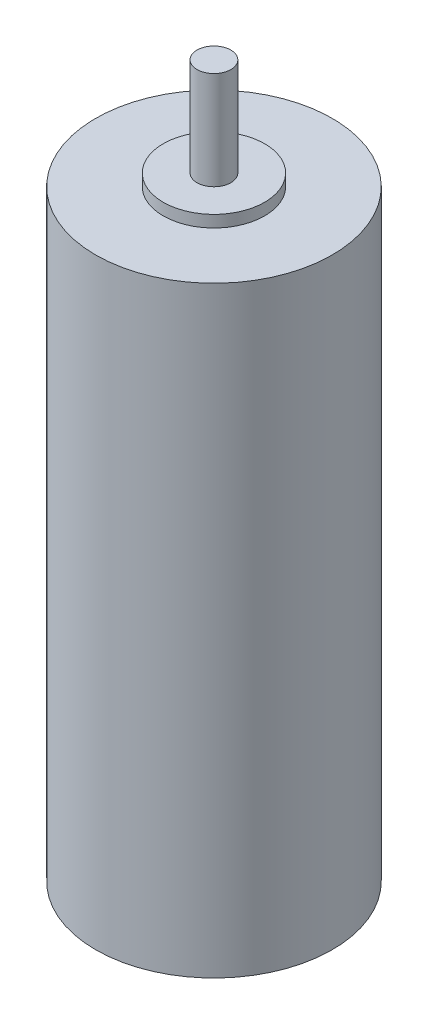
ISO-10303-21;
HEADER;
FILE_DESCRIPTION(('STEP AP214'),'2;1');
FILE_NAME('part.step','',(''),(''),'','','');
FILE_SCHEMA(('AUTOMOTIVE_DESIGN { 1 0 10303 214 1 1 1 1 }'));
ENDSEC;
DATA;
#1=APPLICATION_CONTEXT('core data for automotive mechanical design processes');
#2=APPLICATION_PROTOCOL_DEFINITION('international standard','automotive_design',2000,#1);
#3=PRODUCT_CONTEXT('',#1,'mechanical');
#4=PRODUCT('Part','Part','',(#3));
#5=PRODUCT_RELATED_PRODUCT_CATEGORY('part','',(#4));
#6=PRODUCT_DEFINITION_FORMATION('','',#4);
#7=PRODUCT_DEFINITION_CONTEXT('part definition',#1,'design');
#8=PRODUCT_DEFINITION('design','',#6,#7);
#9=PRODUCT_DEFINITION_SHAPE('','',#8);
#10=(LENGTH_UNIT() NAMED_UNIT(*) SI_UNIT(.MILLI.,.METRE.));
#11=(NAMED_UNIT(*) PLANE_ANGLE_UNIT() SI_UNIT($,.RADIAN.));
#12=(NAMED_UNIT(*) SI_UNIT($,.STERADIAN.) SOLID_ANGLE_UNIT());
#13=UNCERTAINTY_MEASURE_WITH_UNIT(LENGTH_MEASURE(1.E-05),#10,'distance_accuracy_value','');
#14=(GEOMETRIC_REPRESENTATION_CONTEXT(3) GLOBAL_UNCERTAINTY_ASSIGNED_CONTEXT((#13)) GLOBAL_UNIT_ASSIGNED_CONTEXT((#10,
#11,#12)) REPRESENTATION_CONTEXT('',''));
#15=CARTESIAN_POINT('',(0.,0.,0.));
#16=DIRECTION('',(0.,0.,1.));
#17=DIRECTION('',(1.,0.,0.));
#18=AXIS2_PLACEMENT_3D('',#15,#16,#17);
#19=CARTESIAN_POINT('',(0.,35.6,0.));
#20=DIRECTION('',(0.,-1.,0.));
#21=DIRECTION('',(0.,0.,-1.));
#22=AXIS2_PLACEMENT_3D('',#19,#20,#21);
#23=CYLINDRICAL_SURFACE('',#22,7.);
#24=CARTESIAN_POINT('',(0.,35.6,0.));
#25=DIRECTION('',(0.,1.,0.));
#26=DIRECTION('',(0.,0.,1.));
#27=AXIS2_PLACEMENT_3D('',#24,#25,#26);
#28=CIRCLE('',#27,7.);
#29=CARTESIAN_POINT('',(0.,35.6,7.));
#30=VERTEX_POINT('',#29);
#31=EDGE_CURVE('E41',#30,#30,#28,.T.);
#32=ORIENTED_EDGE('',*,*,#31,.F.);
#33=EDGE_LOOP('',(#32));
#34=FACE_BOUND('',#33,.T.);
#35=CARTESIAN_POINT('',(0.,0.,0.));
#36=DIRECTION('',(0.,1.,0.));
#37=DIRECTION('',(0.,0.,1.));
#38=AXIS2_PLACEMENT_3D('',#35,#36,#37);
#39=CIRCLE('',#38,7.);
#40=CARTESIAN_POINT('',(0.,0.,7.));
#41=VERTEX_POINT('',#40);
#42=EDGE_CURVE('E46',#41,#41,#39,.T.);
#43=ORIENTED_EDGE('',*,*,#42,.T.);
#44=EDGE_LOOP('',(#43));
#45=FACE_BOUND('',#44,.T.);
#46=ADVANCED_FACE('F34',(#34,#45),#23,.T.);
#47=CARTESIAN_POINT('',(0.,35.6,0.));
#48=DIRECTION('',(0.,1.,0.));
#49=DIRECTION('',(0.,0.,1.));
#50=AXIS2_PLACEMENT_3D('',#47,#48,#49);
#51=PLANE('',#50);
#52=CARTESIAN_POINT('',(0.,35.6,0.));
#53=DIRECTION('',(0.,1.,0.));
#54=DIRECTION('',(0.,0.,1.));
#55=AXIS2_PLACEMENT_3D('',#52,#53,#54);
#56=CIRCLE('',#55,3.);
#57=CARTESIAN_POINT('',(0.,35.6,3.));
#58=VERTEX_POINT('',#57);
#59=EDGE_CURVE('E10',#58,#58,#56,.T.);
#60=ORIENTED_EDGE('',*,*,#59,.F.);
#61=EDGE_LOOP('',(#60));
#62=FACE_BOUND('',#61,.T.);
#63=ORIENTED_EDGE('',*,*,#31,.T.);
#64=EDGE_LOOP('',(#63));
#65=FACE_BOUND('',#64,.T.);
#66=ADVANCED_FACE('F79',(#62,#65),#51,.T.);
#67=CARTESIAN_POINT('',(0.,0.,0.));
#68=DIRECTION('',(0.,1.,0.));
#69=DIRECTION('',(0.,0.,1.));
#70=AXIS2_PLACEMENT_3D('',#67,#68,#69);
#71=PLANE('',#70);
#72=ORIENTED_EDGE('',*,*,#42,.F.);
#73=EDGE_LOOP('',(#72));
#74=FACE_BOUND('',#73,.T.);
#75=ADVANCED_FACE('F84',(#74),#71,.F.);
#76=CARTESIAN_POINT('',(0.,36.3,0.));
#77=DIRECTION('',(0.,-1.,0.));
#78=DIRECTION('',(0.,0.,-1.));
#79=AXIS2_PLACEMENT_3D('',#76,#77,#78);
#80=CYLINDRICAL_SURFACE('',#79,3.);
#81=CARTESIAN_POINT('',(0.,36.3,0.));
#82=DIRECTION('',(0.,1.,0.));
#83=DIRECTION('',(0.,0.,1.));
#84=AXIS2_PLACEMENT_3D('',#81,#82,#83);
#85=CIRCLE('',#84,3.);
#86=CARTESIAN_POINT('',(0.,36.3,3.));
#87=VERTEX_POINT('',#86);
#88=EDGE_CURVE('E49',#87,#87,#85,.T.);
#89=ORIENTED_EDGE('',*,*,#88,.F.);
#90=EDGE_LOOP('',(#89));
#91=FACE_BOUND('',#90,.T.);
#92=ORIENTED_EDGE('',*,*,#59,.T.);
#93=EDGE_LOOP('',(#92));
#94=FACE_BOUND('',#93,.T.);
#95=ADVANCED_FACE('F76',(#91,#94),#80,.T.);
#96=CARTESIAN_POINT('',(0.,36.3,0.));
#97=DIRECTION('',(0.,1.,0.));
#98=DIRECTION('',(0.,0.,1.));
#99=AXIS2_PLACEMENT_3D('',#96,#97,#98);
#100=PLANE('',#99);
#101=CARTESIAN_POINT('',(0.,36.3,0.));
#102=DIRECTION('',(0.,1.,0.));
#103=DIRECTION('',(0.,0.,1.));
#104=AXIS2_PLACEMENT_3D('',#101,#102,#103);
#105=CIRCLE('',#104,1.);
#106=CARTESIAN_POINT('',(0.,36.3,-1.));
#107=VERTEX_POINT('',#106);
#108=EDGE_CURVE('E37',#107,#107,#105,.F.);
#109=ORIENTED_EDGE('',*,*,#108,.T.);
#110=EDGE_LOOP('',(#109));
#111=FACE_BOUND('',#110,.T.);
#112=ORIENTED_EDGE('',*,*,#88,.T.);
#113=EDGE_LOOP('',(#112));
#114=FACE_BOUND('',#113,.T.);
#115=ADVANCED_FACE('F68',(#111,#114),#100,.T.);
#116=CARTESIAN_POINT('',(0.,42.1,0.));
#117=DIRECTION('',(0.,-1.,0.));
#118=DIRECTION('',(0.,0.,-1.));
#119=AXIS2_PLACEMENT_3D('',#116,#117,#118);
#120=CYLINDRICAL_SURFACE('',#119,1.);
#121=CARTESIAN_POINT('',(0.,42.1,0.));
#122=DIRECTION('',(0.,1.,0.));
#123=DIRECTION('',(0.,0.,1.));
#124=AXIS2_PLACEMENT_3D('',#121,#122,#123);
#125=CIRCLE('',#124,1.);
#126=CARTESIAN_POINT('',(0.,42.1,-1.));
#127=VERTEX_POINT('',#126);
#128=EDGE_CURVE('E58',#127,#127,#125,.T.);
#129=CARTESIAN_POINT('',(0.,36.3,-1.));
#130=CARTESIAN_POINT('',(0.,36.3604166666667,-1.));
#131=CARTESIAN_POINT('',(0.,36.4208333333333,-1.));
#132=CARTESIAN_POINT('',(0.,36.5416666666667,-1.));
#133=CARTESIAN_POINT('',(0.,36.6020833333333,-1.));
#134=CARTESIAN_POINT('',(0.,36.7229166666667,-1.));
#135=CARTESIAN_POINT('',(0.,36.7833333333333,-1.));
#136=CARTESIAN_POINT('',(0.,36.9041666666667,-1.));
#137=CARTESIAN_POINT('',(0.,36.9645833333333,-1.));
#138=CARTESIAN_POINT('',(0.,37.0854166666667,-1.));
#139=CARTESIAN_POINT('',(0.,37.1458333333333,-1.));
#140=CARTESIAN_POINT('',(0.,37.2666666666667,-1.));
#141=CARTESIAN_POINT('',(0.,37.3270833333333,-1.));
#142=CARTESIAN_POINT('',(0.,37.4479166666667,-1.));
#143=CARTESIAN_POINT('',(0.,37.5083333333333,-1.));
#144=CARTESIAN_POINT('',(0.,37.6291666666667,-1.));
#145=CARTESIAN_POINT('',(0.,37.6895833333333,-1.));
#146=CARTESIAN_POINT('',(0.,37.8104166666667,-1.));
#147=CARTESIAN_POINT('',(0.,37.8708333333333,-1.));
#148=CARTESIAN_POINT('',(0.,37.9916666666667,-1.));
#149=CARTESIAN_POINT('',(0.,38.0520833333333,-1.));
#150=CARTESIAN_POINT('',(0.,38.1729166666667,-1.));
#151=CARTESIAN_POINT('',(0.,38.2333333333333,-1.));
#152=CARTESIAN_POINT('',(0.,38.3541666666667,-1.));
#153=CARTESIAN_POINT('',(0.,38.4145833333333,-1.));
#154=CARTESIAN_POINT('',(0.,38.5354166666667,-1.));
#155=CARTESIAN_POINT('',(0.,38.5958333333333,-1.));
#156=CARTESIAN_POINT('',(0.,38.7166666666667,-1.));
#157=CARTESIAN_POINT('',(0.,38.7770833333333,-1.));
#158=CARTESIAN_POINT('',(0.,38.8979166666667,-1.));
#159=CARTESIAN_POINT('',(0.,38.9583333333333,-1.));
#160=CARTESIAN_POINT('',(0.,39.0791666666667,-1.));
#161=CARTESIAN_POINT('',(0.,39.1395833333333,-1.));
#162=CARTESIAN_POINT('',(0.,39.2604166666667,-1.));
#163=CARTESIAN_POINT('',(0.,39.3208333333333,-1.));
#164=CARTESIAN_POINT('',(0.,39.4416666666667,-1.));
#165=CARTESIAN_POINT('',(0.,39.5020833333333,-1.));
#166=CARTESIAN_POINT('',(0.,39.6229166666667,-1.));
#167=CARTESIAN_POINT('',(0.,39.6833333333333,-1.));
#168=CARTESIAN_POINT('',(0.,39.8041666666667,-1.));
#169=CARTESIAN_POINT('',(0.,39.8645833333333,-1.));
#170=CARTESIAN_POINT('',(0.,39.9854166666667,-1.));
#171=CARTESIAN_POINT('',(0.,40.0458333333333,-1.));
#172=CARTESIAN_POINT('',(0.,40.1666666666667,-1.));
#173=CARTESIAN_POINT('',(0.,40.2270833333333,-1.));
#174=CARTESIAN_POINT('',(0.,40.3479166666667,-1.));
#175=CARTESIAN_POINT('',(0.,40.4083333333333,-1.));
#176=CARTESIAN_POINT('',(0.,40.5291666666667,-1.));
#177=CARTESIAN_POINT('',(0.,40.5895833333333,-1.));
#178=CARTESIAN_POINT('',(0.,40.7104166666667,-1.));
#179=CARTESIAN_POINT('',(0.,40.7708333333333,-1.));
#180=CARTESIAN_POINT('',(0.,40.8916666666667,-1.));
#181=CARTESIAN_POINT('',(0.,40.9520833333333,-1.));
#182=CARTESIAN_POINT('',(0.,41.0729166666667,-1.));
#183=CARTESIAN_POINT('',(0.,41.1333333333333,-1.));
#184=CARTESIAN_POINT('',(0.,41.2541666666667,-1.));
#185=CARTESIAN_POINT('',(0.,41.3145833333333,-1.));
#186=CARTESIAN_POINT('',(0.,41.4354166666667,-1.));
#187=CARTESIAN_POINT('',(0.,41.4958333333333,-1.));
#188=CARTESIAN_POINT('',(0.,41.6166666666667,-1.));
#189=CARTESIAN_POINT('',(0.,41.6770833333333,-1.));
#190=CARTESIAN_POINT('',(0.,41.7979166666667,-1.));
#191=CARTESIAN_POINT('',(0.,41.8583333333333,-1.));
#192=CARTESIAN_POINT('',(0.,41.9791666666667,-1.));
#193=CARTESIAN_POINT('',(0.,42.0395833333333,-1.));
#194=CARTESIAN_POINT('',(0.,42.1,-1.));
#195=B_SPLINE_CURVE_WITH_KNOTS('',3,(#129,#130,#131,#132,#133,#134,#135,#136,#137,#138,#139,
#140,#141,#142,#143,#144,#145,#146,#147,#148,#149,#150,#151,#152,#153,#154,#155,#156,#157,#158,
#159,#160,#161,#162,#163,#164,#165,#166,#167,#168,#169,#170,#171,#172,#173,#174,#175,#176,#177,
#178,#179,#180,#181,#182,#183,#184,#185,#186,#187,#188,#189,#190,#191,#192,#193,#194),
.UNSPECIFIED.,.F.,.F.,(4,2,2,2,2,2,2,2,2,2,2,2,2,2,2,2,2,2,2,2,2,2,2,2,2,2,2,2,2,2,2,2,4),(0.,
0.181250000000001,0.362500000000002,0.543750000000003,0.725000000000003,0.906250000000004,
1.08750000000001,1.26875000000001,1.45,1.63125,1.8125,1.99375,2.175,2.35625,2.5375,
2.71875000000001,2.9,3.08125,3.2625,3.44375,3.625,3.80625,3.98750000000001,4.16875000000001,
4.35000000000001,4.53125,4.7125,4.89375,5.075,5.25625,5.4375,5.61875000000001,5.80000000000001),.UNSPECIFIED.);
#196=EDGE_CURVE('BSEAM66',#107,#127,#195,.T.);
#197=ORIENTED_EDGE('',*,*,#108,.F.);
#198=ORIENTED_EDGE('',*,*,#128,.F.);
#199=ORIENTED_EDGE('',*,*,#196,.T.);
#200=ORIENTED_EDGE('',*,*,#196,.F.);
#201=EDGE_LOOP('',(#197,#199,#198,#200));
#202=FACE_BOUND('',#201,.T.);
#203=ADVANCED_FACE('F66',(#202),#120,.T.);
#204=CARTESIAN_POINT('',(0.,42.1,0.));
#205=DIRECTION('',(0.,1.,0.));
#206=DIRECTION('',(0.,0.,1.));
#207=AXIS2_PLACEMENT_3D('',#204,#205,#206);
#208=PLANE('',#207);
#209=ORIENTED_EDGE('',*,*,#128,.T.);
#210=EDGE_LOOP('',(#209));
#211=FACE_BOUND('',#210,.T.);
#212=ADVANCED_FACE('F64',(#211),#208,.T.);
#213=CLOSED_SHELL('',(#46,#66,#75,#95,#115,#203,#212));
#214=MANIFOLD_SOLID_BREP('B2',#213);
#215=ADVANCED_BREP_SHAPE_REPRESENTATION('',(#18,#214),#14);
#216=SHAPE_DEFINITION_REPRESENTATION(#9,#215);
ENDSEC;
END-ISO-10303-21;
